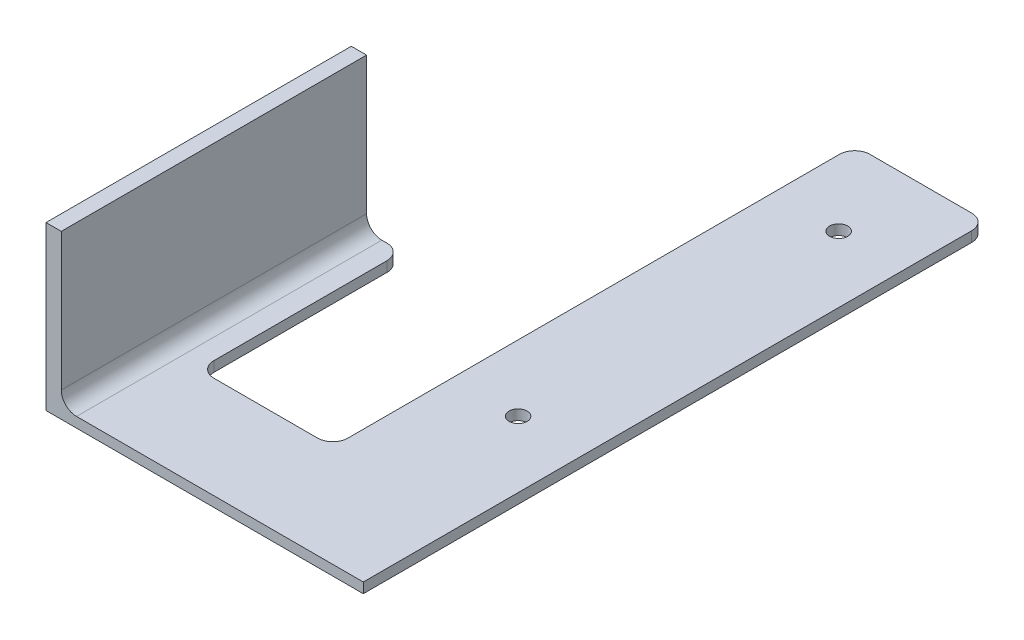
ISO-10303-21;
HEADER;
FILE_DESCRIPTION(('STEP AP214'),'2;1');
FILE_NAME('part.step','',(''),(''),'','','');
FILE_SCHEMA(('AUTOMOTIVE_DESIGN { 1 0 10303 214 1 1 1 1 }'));
ENDSEC;
DATA;
#1=APPLICATION_CONTEXT('core data for automotive mechanical design processes');
#2=APPLICATION_PROTOCOL_DEFINITION('international standard','automotive_design',2000,#1);
#3=PRODUCT_CONTEXT('',#1,'mechanical');
#4=PRODUCT('Part','Part','',(#3));
#5=PRODUCT_RELATED_PRODUCT_CATEGORY('part','',(#4));
#6=PRODUCT_DEFINITION_FORMATION('','',#4);
#7=PRODUCT_DEFINITION_CONTEXT('part definition',#1,'design');
#8=PRODUCT_DEFINITION('design','',#6,#7);
#9=PRODUCT_DEFINITION_SHAPE('','',#8);
#10=(LENGTH_UNIT() NAMED_UNIT(*) SI_UNIT(.MILLI.,.METRE.));
#11=(NAMED_UNIT(*) PLANE_ANGLE_UNIT() SI_UNIT($,.RADIAN.));
#12=(NAMED_UNIT(*) SI_UNIT($,.STERADIAN.) SOLID_ANGLE_UNIT());
#13=UNCERTAINTY_MEASURE_WITH_UNIT(LENGTH_MEASURE(1.E-05),#10,'distance_accuracy_value','');
#14=(GEOMETRIC_REPRESENTATION_CONTEXT(3) GLOBAL_UNCERTAINTY_ASSIGNED_CONTEXT((#13)) GLOBAL_UNIT_ASSIGNED_CONTEXT((#10,
#11,#12)) REPRESENTATION_CONTEXT('',''));
#15=CARTESIAN_POINT('',(0.,0.,0.));
#16=DIRECTION('',(0.,0.,1.));
#17=DIRECTION('',(1.,0.,0.));
#18=AXIS2_PLACEMENT_3D('',#15,#16,#17);
#19=CARTESIAN_POINT('',(-2.47407072094367E-13,2.54,-74.5591968403108));
#20=DIRECTION('',(0.,0.,1.));
#21=DIRECTION('',(1.,0.,0.));
#22=AXIS2_PLACEMENT_3D('',#19,#20,#21);
#23=PLANE('',#22);
#24=DIRECTION('',(-1.,0.,0.));
#25=VECTOR('',#24,1.);
#26=CARTESIAN_POINT('',(-2.47407072094367E-13,2.54,-74.5591968403108));
#27=LINE('',#26,#25);
#28=CARTESIAN_POINT('',(-46.7377884397438,2.54,-74.5591968403106));
#29=VERTEX_POINT('',#28);
#30=CARTESIAN_POINT('',(-72.1377884397438,2.54,-74.5591968403106));
#31=VERTEX_POINT('',#30);
#32=EDGE_CURVE('E254',#29,#31,#27,.T.);
#33=ORIENTED_EDGE('',*,*,#32,.F.);
#34=DIRECTION('',(0.,1.,0.));
#35=VECTOR('',#34,1.);
#36=CARTESIAN_POINT('',(-46.7377884397438,2.54,-74.5591968403106));
#37=LINE('',#36,#35);
#38=CARTESIAN_POINT('',(-46.7377884397438,0.,-74.5591968403106));
#39=VERTEX_POINT('',#38);
#40=EDGE_CURVE('E220',#29,#39,#37,.F.);
#41=ORIENTED_EDGE('',*,*,#40,.T.);
#42=DIRECTION('',(-1.,0.,0.));
#43=VECTOR('',#42,1.);
#44=CARTESIAN_POINT('',(-2.47407072094367E-13,0.,-74.5591968403108));
#45=LINE('',#44,#43);
#46=CARTESIAN_POINT('',(-72.1377884397438,0.,-74.5591968403106));
#47=VERTEX_POINT('',#46);
#48=EDGE_CURVE('E266',#39,#47,#45,.T.);
#49=ORIENTED_EDGE('',*,*,#48,.T.);
#50=DIRECTION('',(0.,1.,0.));
#51=VECTOR('',#50,1.);
#52=CARTESIAN_POINT('',(-72.1377884397438,2.54,-74.5591968403106));
#53=LINE('',#52,#51);
#54=EDGE_CURVE('E217',#47,#31,#53,.T.);
#55=ORIENTED_EDGE('',*,*,#54,.T.);
#56=EDGE_LOOP('',(#33,#41,#49,#55));
#57=FACE_BOUND('',#56,.T.);
#58=ADVANCED_FACE('F41',(#57),#23,.F.);
#59=CARTESIAN_POINT('',(0.,2.54,0.));
#60=DIRECTION('',(0.,1.,0.));
#61=DIRECTION('',(0.,0.,1.));
#62=AXIS2_PLACEMENT_3D('',#59,#60,#61);
#63=PLANE('',#62);
#64=DIRECTION('',(0.,0.,1.));
#65=VECTOR('',#64,1.);
#66=CARTESIAN_POINT('',(-42.9277884397437,2.54,0.));
#67=LINE('',#66,#65);
#68=CARTESIAN_POINT('',(-42.9277884397437,2.54,-70.7491968403107));
#69=VERTEX_POINT('',#68);
#70=CARTESIAN_POINT('',(-42.9277884397437,2.54,81.0998031596896));
#71=VERTEX_POINT('',#70);
#72=EDGE_CURVE('E251',#69,#71,#67,.T.);
#73=ORIENTED_EDGE('',*,*,#72,.F.);
#74=CARTESIAN_POINT('',(-46.7377884397437,2.54,-70.7491968403107));
#75=DIRECTION('',(0.,1.,0.));
#76=DIRECTION('',(0.,0.,1.));
#77=AXIS2_PLACEMENT_3D('',#74,#75,#76);
#78=CIRCLE('',#77,3.81);
#79=EDGE_CURVE('E215',#69,#29,#78,.T.);
#80=ORIENTED_EDGE('',*,*,#79,.T.);
#81=ORIENTED_EDGE('',*,*,#32,.T.);
#82=CARTESIAN_POINT('',(-72.1377884397437,2.54,-70.7491968403106));
#83=DIRECTION('',(0.,1.,0.));
#84=DIRECTION('',(0.,0.,1.));
#85=AXIS2_PLACEMENT_3D('',#82,#83,#84);
#86=CIRCLE('',#85,3.81);
#87=CARTESIAN_POINT('',(-75.9477884397437,2.54,-70.7491968403106));
#88=VERTEX_POINT('',#87);
#89=EDGE_CURVE('E213',#31,#88,#86,.T.);
#90=ORIENTED_EDGE('',*,*,#89,.T.);
#91=DIRECTION('',(0.,0.,1.));
#92=VECTOR('',#91,1.);
#93=CARTESIAN_POINT('',(-75.9477884397437,2.54,0.));
#94=LINE('',#93,#92);
#95=CARTESIAN_POINT('',(-75.9477884397437,2.54,51.8898031596896));
#96=VERTEX_POINT('',#95);
#97=EDGE_CURVE('E240',#88,#96,#94,.T.);
#98=ORIENTED_EDGE('',*,*,#97,.T.);
#99=CARTESIAN_POINT('',(-79.7577884397437,2.54,51.8898031596896));
#100=DIRECTION('',(0.,1.,0.));
#101=DIRECTION('',(0.,0.,1.));
#102=AXIS2_PLACEMENT_3D('',#99,#100,#101);
#103=CIRCLE('',#102,3.81);
#104=CARTESIAN_POINT('',(-79.7577884397437,2.54,55.6998031596896));
#105=VERTEX_POINT('',#104);
#106=EDGE_CURVE('E200',#96,#105,#103,.F.);
#107=ORIENTED_EDGE('',*,*,#106,.T.);
#108=DIRECTION('',(-1.,0.,0.));
#109=VECTOR('',#108,1.);
#110=CARTESIAN_POINT('',(0.,2.54,55.6998031596896));
#111=LINE('',#110,#109);
#112=CARTESIAN_POINT('',(-105.610032318675,2.54,55.6998031596896));
#113=VERTEX_POINT('',#112);
#114=EDGE_CURVE('E237',#105,#113,#111,.T.);
#115=ORIENTED_EDGE('',*,*,#114,.T.);
#116=CARTESIAN_POINT('',(-105.610032318675,2.54,51.8898031596896));
#117=DIRECTION('',(0.,1.,0.));
#118=DIRECTION('',(0.,0.,1.));
#119=AXIS2_PLACEMENT_3D('',#116,#117,#118);
#120=CIRCLE('',#119,3.81);
#121=CARTESIAN_POINT('',(-109.420032318675,2.54,51.8898031596896));
#122=VERTEX_POINT('',#121);
#123=EDGE_CURVE('E205',#113,#122,#120,.F.);
#124=ORIENTED_EDGE('',*,*,#123,.T.);
#125=DIRECTION('',(0.,0.,-1.));
#126=VECTOR('',#125,1.);
#127=CARTESIAN_POINT('',(-109.420032318675,2.54,0.));
#128=LINE('',#127,#126);
#129=CARTESIAN_POINT('',(-109.420032318675,2.54,8.70980315968959));
#130=VERTEX_POINT('',#129);
#131=EDGE_CURVE('E232',#122,#130,#128,.T.);
#132=ORIENTED_EDGE('',*,*,#131,.T.);
#133=CARTESIAN_POINT('',(-113.230032318675,2.54,8.70980315968959));
#134=DIRECTION('',(0.,1.,0.));
#135=DIRECTION('',(0.,0.,1.));
#136=AXIS2_PLACEMENT_3D('',#133,#134,#135);
#137=CIRCLE('',#136,3.81);
#138=CARTESIAN_POINT('',(-113.230032318675,2.54,4.89980315968959));
#139=VERTEX_POINT('',#138);
#140=EDGE_CURVE('E165',#130,#139,#137,.T.);
#141=ORIENTED_EDGE('',*,*,#140,.T.);
#142=DIRECTION('',(1.,0.,0.));
#143=VECTOR('',#142,1.);
#144=CARTESIAN_POINT('',(0.,2.54,4.89980315968959));
#145=LINE('',#144,#143);
#146=CARTESIAN_POINT('',(-114.500032318675,2.54,4.89980315968959));
#147=VERTEX_POINT('',#146);
#148=EDGE_CURVE('E155',#147,#139,#145,.T.);
#149=ORIENTED_EDGE('',*,*,#148,.F.);
#150=DIRECTION('',(0.,0.,-1.));
#151=VECTOR('',#150,1.);
#152=CARTESIAN_POINT('',(-114.500032318675,2.54,0.));
#153=LINE('',#152,#151);
#154=CARTESIAN_POINT('',(-114.500032318675,2.54,81.0998031596896));
#155=VERTEX_POINT('',#154);
#156=EDGE_CURVE('E162',#147,#155,#153,.F.);
#157=ORIENTED_EDGE('',*,*,#156,.T.);
#158=DIRECTION('',(1.,0.,0.));
#159=VECTOR('',#158,1.);
#160=CARTESIAN_POINT('',(0.,2.54,81.0998031596896));
#161=LINE('',#160,#159);
#162=EDGE_CURVE('E257',#155,#71,#161,.T.);
#163=ORIENTED_EDGE('',*,*,#162,.T.);
#164=EDGE_LOOP('',(#73,#80,#81,#90,#98,#107,#115,#124,#132,#141,#149,#157,#163));
#165=FACE_BOUND('',#164,.T.);
#166=CARTESIAN_POINT('',(-59.4377884397437,2.54,25.9508031596896));
#167=DIRECTION('',(0.,1.,0.));
#168=DIRECTION('',(0.,0.,1.));
#169=AXIS2_PLACEMENT_3D('',#166,#167,#168);
#170=CIRCLE('',#169,2.24999999999995);
#171=CARTESIAN_POINT('',(-59.4377884397437,2.54,28.2008031596895));
#172=VERTEX_POINT('',#171);
#173=EDGE_CURVE('E260',#172,#172,#170,.T.);
#174=ORIENTED_EDGE('',*,*,#173,.F.);
#175=EDGE_LOOP('',(#174));
#176=FACE_BOUND('',#175,.T.);
#177=CARTESIAN_POINT('',(-59.4377884397437,2.54,-54.0491968403104));
#178=DIRECTION('',(0.,1.,0.));
#179=DIRECTION('',(0.,0.,1.));
#180=AXIS2_PLACEMENT_3D('',#177,#178,#179);
#181=CIRCLE('',#180,2.24999999999995);
#182=CARTESIAN_POINT('',(-59.4377884397437,2.54,-51.7991968403105));
#183=VERTEX_POINT('',#182);
#184=EDGE_CURVE('E263',#183,#183,#181,.T.);
#185=ORIENTED_EDGE('',*,*,#184,.F.);
#186=EDGE_LOOP('',(#185));
#187=FACE_BOUND('',#186,.T.);
#188=ADVANCED_FACE('F158',(#165,#176,#187),#63,.T.);
#189=CARTESIAN_POINT('',(0.,0.,0.));
#190=DIRECTION('',(0.,1.,0.));
#191=DIRECTION('',(0.,0.,1.));
#192=AXIS2_PLACEMENT_3D('',#189,#190,#191);
#193=PLANE('',#192);
#194=CARTESIAN_POINT('',(-59.4377884397437,0.,-54.0491968403104));
#195=DIRECTION('',(0.,1.,0.));
#196=DIRECTION('',(0.,0.,1.));
#197=AXIS2_PLACEMENT_3D('',#194,#195,#196);
#198=CIRCLE('',#197,2.24999999999995);
#199=CARTESIAN_POINT('',(-59.4377884397437,0.,-51.7991968403105));
#200=VERTEX_POINT('',#199);
#201=EDGE_CURVE('E258',#200,#200,#198,.T.);
#202=ORIENTED_EDGE('',*,*,#201,.T.);
#203=EDGE_LOOP('',(#202));
#204=FACE_BOUND('',#203,.T.);
#205=CARTESIAN_POINT('',(-59.4377884397437,0.,25.9508031596896));
#206=DIRECTION('',(0.,1.,0.));
#207=DIRECTION('',(0.,0.,1.));
#208=AXIS2_PLACEMENT_3D('',#205,#206,#207);
#209=CIRCLE('',#208,2.24999999999995);
#210=CARTESIAN_POINT('',(-59.4377884397437,0.,28.2008031596895));
#211=VERTEX_POINT('',#210);
#212=EDGE_CURVE('E275',#211,#211,#209,.T.);
#213=ORIENTED_EDGE('',*,*,#212,.T.);
#214=EDGE_LOOP('',(#213));
#215=FACE_BOUND('',#214,.T.);
#216=ORIENTED_EDGE('',*,*,#48,.F.);
#217=CARTESIAN_POINT('',(-46.7377884397437,0.,-70.7491968403107));
#218=DIRECTION('',(0.,1.,0.));
#219=DIRECTION('',(0.,0.,1.));
#220=AXIS2_PLACEMENT_3D('',#217,#218,#219);
#221=CIRCLE('',#220,3.81);
#222=CARTESIAN_POINT('',(-42.9277884397437,0.,-70.7491968403107));
#223=VERTEX_POINT('',#222);
#224=EDGE_CURVE('E225',#39,#223,#221,.F.);
#225=ORIENTED_EDGE('',*,*,#224,.T.);
#226=DIRECTION('',(0.,0.,1.));
#227=VECTOR('',#226,1.);
#228=CARTESIAN_POINT('',(-42.9277884397437,0.,0.));
#229=LINE('',#228,#227);
#230=CARTESIAN_POINT('',(-42.9277884397437,0.,81.0998031596896));
#231=VERTEX_POINT('',#230);
#232=EDGE_CURVE('E243',#223,#231,#229,.T.);
#233=ORIENTED_EDGE('',*,*,#232,.T.);
#234=DIRECTION('',(1.,0.,0.));
#235=VECTOR('',#234,1.);
#236=CARTESIAN_POINT('',(0.,0.,81.0998031596896));
#237=LINE('',#236,#235);
#238=CARTESIAN_POINT('',(-122.120032318675,0.,81.0998031596896));
#239=VERTEX_POINT('',#238);
#240=EDGE_CURVE('E272',#239,#231,#237,.T.);
#241=ORIENTED_EDGE('',*,*,#240,.F.);
#242=DIRECTION('',(0.,0.,-1.));
#243=VECTOR('',#242,1.);
#244=CARTESIAN_POINT('',(-122.120032318675,0.,0.));
#245=LINE('',#244,#243);
#246=CARTESIAN_POINT('',(-122.120032318675,0.,4.89980315968959));
#247=VERTEX_POINT('',#246);
#248=EDGE_CURVE('E269',#239,#247,#245,.T.);
#249=ORIENTED_EDGE('',*,*,#248,.T.);
#250=DIRECTION('',(1.,0.,0.));
#251=VECTOR('',#250,1.);
#252=CARTESIAN_POINT('',(0.,0.,4.89980315968959));
#253=LINE('',#252,#251);
#254=CARTESIAN_POINT('',(-113.230032318675,0.,4.89980315968959));
#255=VERTEX_POINT('',#254);
#256=EDGE_CURVE('E168',#247,#255,#253,.T.);
#257=ORIENTED_EDGE('',*,*,#256,.T.);
#258=CARTESIAN_POINT('',(-113.230032318675,0.,8.70980315968959));
#259=DIRECTION('',(0.,1.,0.));
#260=DIRECTION('',(0.,0.,1.));
#261=AXIS2_PLACEMENT_3D('',#258,#259,#260);
#262=CIRCLE('',#261,3.81);
#263=CARTESIAN_POINT('',(-109.420032318675,0.,8.70980315968959));
#264=VERTEX_POINT('',#263);
#265=EDGE_CURVE('E64',#255,#264,#262,.F.);
#266=ORIENTED_EDGE('',*,*,#265,.T.);
#267=DIRECTION('',(0.,0.,-1.));
#268=VECTOR('',#267,1.);
#269=CARTESIAN_POINT('',(-109.420032318675,0.,0.));
#270=LINE('',#269,#268);
#271=CARTESIAN_POINT('',(-109.420032318675,0.,51.8898031596896));
#272=VERTEX_POINT('',#271);
#273=EDGE_CURVE('E234',#272,#264,#270,.T.);
#274=ORIENTED_EDGE('',*,*,#273,.F.);
#275=CARTESIAN_POINT('',(-105.610032318675,0.,51.8898031596896));
#276=DIRECTION('',(0.,1.,0.));
#277=DIRECTION('',(0.,0.,1.));
#278=AXIS2_PLACEMENT_3D('',#275,#276,#277);
#279=CIRCLE('',#278,3.81);
#280=CARTESIAN_POINT('',(-105.610032318675,0.,55.6998031596896));
#281=VERTEX_POINT('',#280);
#282=EDGE_CURVE('E207',#272,#281,#279,.T.);
#283=ORIENTED_EDGE('',*,*,#282,.T.);
#284=DIRECTION('',(-1.,0.,0.));
#285=VECTOR('',#284,1.);
#286=CARTESIAN_POINT('',(0.,0.,55.6998031596896));
#287=LINE('',#286,#285);
#288=CARTESIAN_POINT('',(-79.7577884397437,0.,55.6998031596896));
#289=VERTEX_POINT('',#288);
#290=EDGE_CURVE('E310',#289,#281,#287,.T.);
#291=ORIENTED_EDGE('',*,*,#290,.F.);
#292=CARTESIAN_POINT('',(-79.7577884397437,0.,51.8898031596896));
#293=DIRECTION('',(0.,1.,0.));
#294=DIRECTION('',(0.,0.,1.));
#295=AXIS2_PLACEMENT_3D('',#292,#293,#294);
#296=CIRCLE('',#295,3.81);
#297=CARTESIAN_POINT('',(-75.9477884397437,0.,51.8898031596896));
#298=VERTEX_POINT('',#297);
#299=EDGE_CURVE('E202',#289,#298,#296,.T.);
#300=ORIENTED_EDGE('',*,*,#299,.T.);
#301=DIRECTION('',(0.,0.,1.));
#302=VECTOR('',#301,1.);
#303=CARTESIAN_POINT('',(-75.9477884397437,0.,0.));
#304=LINE('',#303,#302);
#305=CARTESIAN_POINT('',(-75.9477884397437,0.,-70.7491968403106));
#306=VERTEX_POINT('',#305);
#307=EDGE_CURVE('E246',#306,#298,#304,.T.);
#308=ORIENTED_EDGE('',*,*,#307,.F.);
#309=CARTESIAN_POINT('',(-72.1377884397437,0.,-70.7491968403106));
#310=DIRECTION('',(0.,1.,0.));
#311=DIRECTION('',(0.,0.,1.));
#312=AXIS2_PLACEMENT_3D('',#309,#310,#311);
#313=CIRCLE('',#312,3.81);
#314=EDGE_CURVE('E223',#306,#47,#313,.F.);
#315=ORIENTED_EDGE('',*,*,#314,.T.);
#316=EDGE_LOOP('',(#216,#225,#233,#241,#249,#257,#266,#274,#283,#291,#300,#308,#315));
#317=FACE_BOUND('',#316,.T.);
#318=ADVANCED_FACE('F290',(#204,#215,#317),#193,.F.);
#319=CARTESIAN_POINT('',(-122.120032318675,2.54,0.));
#320=DIRECTION('',(-1.,0.,0.));
#321=DIRECTION('',(0.,0.,1.));
#322=AXIS2_PLACEMENT_3D('',#319,#320,#321);
#323=PLANE('',#322);
#324=DIRECTION('',(0.,-1.,0.));
#325=VECTOR('',#324,1.);
#326=CARTESIAN_POINT('',(-122.120032318675,40.64,4.89980315968959));
#327=LINE('',#326,#325);
#328=CARTESIAN_POINT('',(-122.120032318675,40.64,4.89980315968959));
#329=VERTEX_POINT('',#328);
#330=EDGE_CURVE('E295',#329,#247,#327,.T.);
#331=ORIENTED_EDGE('',*,*,#330,.T.);
#332=ORIENTED_EDGE('',*,*,#248,.F.);
#333=DIRECTION('',(0.,-1.,0.));
#334=VECTOR('',#333,1.);
#335=CARTESIAN_POINT('',(-122.120032318675,2.54,81.0998031596896));
#336=LINE('',#335,#334);
#337=CARTESIAN_POINT('',(-122.120032318675,40.64,81.0998031596896));
#338=VERTEX_POINT('',#337);
#339=EDGE_CURVE('E185',#338,#239,#336,.T.);
#340=ORIENTED_EDGE('',*,*,#339,.F.);
#341=DIRECTION('',(0.,0.,1.));
#342=VECTOR('',#341,1.);
#343=CARTESIAN_POINT('',(-122.120032318675,40.64,81.0998031596896));
#344=LINE('',#343,#342);
#345=EDGE_CURVE('E297',#329,#338,#344,.T.);
#346=ORIENTED_EDGE('',*,*,#345,.F.);
#347=EDGE_LOOP('',(#331,#332,#340,#346));
#348=FACE_BOUND('',#347,.T.);
#349=ADVANCED_FACE('F293',(#348),#323,.T.);
#350=CARTESIAN_POINT('',(-59.4377884397437,2.54,25.9508031596896));
#351=DIRECTION('',(0.,-1.,0.));
#352=DIRECTION('',(0.,0.,-1.));
#353=AXIS2_PLACEMENT_3D('',#350,#351,#352);
#354=CYLINDRICAL_SURFACE('',#353,2.24999999999995);
#355=ORIENTED_EDGE('',*,*,#173,.T.);
#356=EDGE_LOOP('',(#355));
#357=FACE_BOUND('',#356,.T.);
#358=ORIENTED_EDGE('',*,*,#212,.F.);
#359=EDGE_LOOP('',(#358));
#360=FACE_BOUND('',#359,.T.);
#361=ADVANCED_FACE('F383',(#357,#360),#354,.F.);
#362=CARTESIAN_POINT('',(0.,2.54,81.0998031596896));
#363=DIRECTION('',(0.,0.,-1.));
#364=DIRECTION('',(-1.,0.,0.));
#365=AXIS2_PLACEMENT_3D('',#362,#363,#364);
#366=PLANE('',#365);
#367=ORIENTED_EDGE('',*,*,#240,.T.);
#368=DIRECTION('',(0.,1.,0.));
#369=VECTOR('',#368,1.);
#370=CARTESIAN_POINT('',(-42.9277884397437,0.,81.0998031596896));
#371=LINE('',#370,#369);
#372=EDGE_CURVE('E238',#231,#71,#371,.T.);
#373=ORIENTED_EDGE('',*,*,#372,.T.);
#374=ORIENTED_EDGE('',*,*,#162,.F.);
#375=CARTESIAN_POINT('',(-114.500032318675,6.35,81.0998031596896));
#376=DIRECTION('',(0.,0.,-1.));
#377=DIRECTION('',(-1.,0.,0.));
#378=AXIS2_PLACEMENT_3D('',#375,#376,#377);
#379=CIRCLE('',#378,3.81);
#380=CARTESIAN_POINT('',(-118.310032318675,6.35000000000002,81.0998031596896));
#381=VERTEX_POINT('',#380);
#382=EDGE_CURVE('E179',#155,#381,#379,.T.);
#383=ORIENTED_EDGE('',*,*,#382,.T.);
#384=DIRECTION('',(0.,-1.,0.));
#385=VECTOR('',#384,1.);
#386=CARTESIAN_POINT('',(-118.310032318675,40.64,81.0998031596896));
#387=LINE('',#386,#385);
#388=CARTESIAN_POINT('',(-118.310032318675,40.64,81.0998031596896));
#389=VERTEX_POINT('',#388);
#390=EDGE_CURVE('E252',#389,#381,#387,.T.);
#391=ORIENTED_EDGE('',*,*,#390,.F.);
#392=DIRECTION('',(1.,0.,0.));
#393=VECTOR('',#392,1.);
#394=CARTESIAN_POINT('',(-122.120032318675,40.64,81.0998031596896));
#395=LINE('',#394,#393);
#396=EDGE_CURVE('E284',#338,#389,#395,.T.);
#397=ORIENTED_EDGE('',*,*,#396,.F.);
#398=ORIENTED_EDGE('',*,*,#339,.T.);
#399=EDGE_LOOP('',(#367,#373,#374,#383,#391,#397,#398));
#400=FACE_BOUND('',#399,.T.);
#401=ADVANCED_FACE('F282',(#400),#366,.F.);
#402=CARTESIAN_POINT('',(-59.4377884397437,2.54,-54.0491968403104));
#403=DIRECTION('',(0.,-1.,0.));
#404=DIRECTION('',(0.,0.,-1.));
#405=AXIS2_PLACEMENT_3D('',#402,#403,#404);
#406=CYLINDRICAL_SURFACE('',#405,2.24999999999995);
#407=ORIENTED_EDGE('',*,*,#184,.T.);
#408=EDGE_LOOP('',(#407));
#409=FACE_BOUND('',#408,.T.);
#410=ORIENTED_EDGE('',*,*,#201,.F.);
#411=EDGE_LOOP('',(#410));
#412=FACE_BOUND('',#411,.T.);
#413=ADVANCED_FACE('F374',(#409,#412),#406,.F.);
#414=CARTESIAN_POINT('',(-42.9277884397437,0.,0.));
#415=DIRECTION('',(-1.,0.,0.));
#416=DIRECTION('',(0.,0.,1.));
#417=AXIS2_PLACEMENT_3D('',#414,#415,#416);
#418=PLANE('',#417);
#419=ORIENTED_EDGE('',*,*,#232,.F.);
#420=DIRECTION('',(0.,1.,0.));
#421=VECTOR('',#420,1.);
#422=CARTESIAN_POINT('',(-42.9277884397437,0.,-70.7491968403107));
#423=LINE('',#422,#421);
#424=EDGE_CURVE('E209',#223,#69,#423,.T.);
#425=ORIENTED_EDGE('',*,*,#424,.T.);
#426=ORIENTED_EDGE('',*,*,#72,.T.);
#427=ORIENTED_EDGE('',*,*,#372,.F.);
#428=EDGE_LOOP('',(#419,#425,#426,#427));
#429=FACE_BOUND('',#428,.T.);
#430=ADVANCED_FACE('F372',(#429),#418,.F.);
#431=CARTESIAN_POINT('',(-109.420032318675,0.,0.));
#432=DIRECTION('',(1.,0.,0.));
#433=DIRECTION('',(0.,0.,-1.));
#434=AXIS2_PLACEMENT_3D('',#431,#432,#433);
#435=PLANE('',#434);
#436=ORIENTED_EDGE('',*,*,#273,.T.);
#437=DIRECTION('',(0.,1.,0.));
#438=VECTOR('',#437,1.);
#439=CARTESIAN_POINT('',(-109.420032318675,2.54,8.70980315968959));
#440=LINE('',#439,#438);
#441=EDGE_CURVE('E49',#264,#130,#440,.T.);
#442=ORIENTED_EDGE('',*,*,#441,.T.);
#443=ORIENTED_EDGE('',*,*,#131,.F.);
#444=DIRECTION('',(0.,1.,0.));
#445=VECTOR('',#444,1.);
#446=CARTESIAN_POINT('',(-109.420032318675,0.,51.8898031596896));
#447=LINE('',#446,#445);
#448=EDGE_CURVE('E198',#122,#272,#447,.F.);
#449=ORIENTED_EDGE('',*,*,#448,.T.);
#450=EDGE_LOOP('',(#436,#442,#443,#449));
#451=FACE_BOUND('',#450,.T.);
#452=ADVANCED_FACE('F231',(#451),#435,.T.);
#453=CARTESIAN_POINT('',(-75.9477884397437,0.,0.));
#454=DIRECTION('',(-1.,0.,0.));
#455=DIRECTION('',(0.,0.,1.));
#456=AXIS2_PLACEMENT_3D('',#453,#454,#455);
#457=PLANE('',#456);
#458=ORIENTED_EDGE('',*,*,#97,.F.);
#459=DIRECTION('',(0.,1.,0.));
#460=VECTOR('',#459,1.);
#461=CARTESIAN_POINT('',(-75.9477884397437,0.,-70.7491968403106));
#462=LINE('',#461,#460);
#463=EDGE_CURVE('E56',#88,#306,#462,.F.);
#464=ORIENTED_EDGE('',*,*,#463,.T.);
#465=ORIENTED_EDGE('',*,*,#307,.T.);
#466=DIRECTION('',(0.,1.,0.));
#467=VECTOR('',#466,1.);
#468=CARTESIAN_POINT('',(-75.9477884397437,2.54,51.8898031596896));
#469=LINE('',#468,#467);
#470=EDGE_CURVE('E190',#298,#96,#469,.T.);
#471=ORIENTED_EDGE('',*,*,#470,.T.);
#472=EDGE_LOOP('',(#458,#464,#465,#471));
#473=FACE_BOUND('',#472,.T.);
#474=ADVANCED_FACE('F315',(#473),#457,.T.);
#475=CARTESIAN_POINT('',(0.,0.,55.6998031596896));
#476=DIRECTION('',(0.,0.,-1.));
#477=DIRECTION('',(-1.,0.,0.));
#478=AXIS2_PLACEMENT_3D('',#475,#476,#477);
#479=PLANE('',#478);
#480=ORIENTED_EDGE('',*,*,#114,.F.);
#481=DIRECTION('',(0.,1.,0.));
#482=VECTOR('',#481,1.);
#483=CARTESIAN_POINT('',(-79.7577884397437,0.,55.6998031596896));
#484=LINE('',#483,#482);
#485=EDGE_CURVE('E196',#105,#289,#484,.F.);
#486=ORIENTED_EDGE('',*,*,#485,.T.);
#487=ORIENTED_EDGE('',*,*,#290,.T.);
#488=DIRECTION('',(0.,1.,0.));
#489=VECTOR('',#488,1.);
#490=CARTESIAN_POINT('',(-105.610032318675,2.54,55.6998031596896));
#491=LINE('',#490,#489);
#492=EDGE_CURVE('E193',#281,#113,#491,.T.);
#493=ORIENTED_EDGE('',*,*,#492,.T.);
#494=EDGE_LOOP('',(#480,#486,#487,#493));
#495=FACE_BOUND('',#494,.T.);
#496=ADVANCED_FACE('F324',(#495),#479,.T.);
#497=CARTESIAN_POINT('',(-118.310032318675,40.64,81.0998031596896));
#498=DIRECTION('',(-1.,0.,0.));
#499=DIRECTION('',(0.,0.,1.));
#500=AXIS2_PLACEMENT_3D('',#497,#498,#499);
#501=PLANE('',#500);
#502=ORIENTED_EDGE('',*,*,#390,.T.);
#503=DIRECTION('',(0.,0.,-1.));
#504=VECTOR('',#503,1.);
#505=CARTESIAN_POINT('',(-118.310032318675,6.35,81.0998031596896));
#506=LINE('',#505,#504);
#507=CARTESIAN_POINT('',(-118.310032318675,6.35000000000002,4.89980315968959));
#508=VERTEX_POINT('',#507);
#509=EDGE_CURVE('E183',#381,#508,#506,.T.);
#510=ORIENTED_EDGE('',*,*,#509,.T.);
#511=DIRECTION('',(0.,-1.,0.));
#512=VECTOR('',#511,1.);
#513=CARTESIAN_POINT('',(-118.310032318675,40.64,4.89980315968959));
#514=LINE('',#513,#512);
#515=CARTESIAN_POINT('',(-118.310032318675,40.64,4.89980315968959));
#516=VERTEX_POINT('',#515);
#517=EDGE_CURVE('E175',#516,#508,#514,.T.);
#518=ORIENTED_EDGE('',*,*,#517,.F.);
#519=DIRECTION('',(0.,0.,-1.));
#520=VECTOR('',#519,1.);
#521=CARTESIAN_POINT('',(-118.310032318675,40.64,81.0998031596896));
#522=LINE('',#521,#520);
#523=EDGE_CURVE('E304',#389,#516,#522,.T.);
#524=ORIENTED_EDGE('',*,*,#523,.F.);
#525=EDGE_LOOP('',(#502,#510,#518,#524));
#526=FACE_BOUND('',#525,.T.);
#527=ADVANCED_FACE('F360',(#526),#501,.F.);
#528=CARTESIAN_POINT('',(-122.120032318675,40.64,4.89980315968959));
#529=DIRECTION('',(0.,0.,1.));
#530=DIRECTION('',(1.,0.,0.));
#531=AXIS2_PLACEMENT_3D('',#528,#529,#530);
#532=PLANE('',#531);
#533=ORIENTED_EDGE('',*,*,#148,.T.);
#534=DIRECTION('',(0.,1.,0.));
#535=VECTOR('',#534,1.);
#536=CARTESIAN_POINT('',(-113.230032318675,0.,4.89980315968959));
#537=LINE('',#536,#535);
#538=EDGE_CURVE('E11',#139,#255,#537,.F.);
#539=ORIENTED_EDGE('',*,*,#538,.T.);
#540=ORIENTED_EDGE('',*,*,#256,.F.);
#541=ORIENTED_EDGE('',*,*,#330,.F.);
#542=DIRECTION('',(-1.,0.,0.));
#543=VECTOR('',#542,1.);
#544=CARTESIAN_POINT('',(-122.120032318675,40.64,4.89980315968959));
#545=LINE('',#544,#543);
#546=EDGE_CURVE('E298',#516,#329,#545,.T.);
#547=ORIENTED_EDGE('',*,*,#546,.F.);
#548=ORIENTED_EDGE('',*,*,#517,.T.);
#549=CARTESIAN_POINT('',(-114.500032318675,6.35,4.89980315968959));
#550=DIRECTION('',(0.,0.,1.));
#551=DIRECTION('',(1.,0.,0.));
#552=AXIS2_PLACEMENT_3D('',#549,#550,#551);
#553=CIRCLE('',#552,3.81);
#554=EDGE_CURVE('E171',#508,#147,#553,.T.);
#555=ORIENTED_EDGE('',*,*,#554,.T.);
#556=EDGE_LOOP('',(#533,#539,#540,#541,#547,#548,#555));
#557=FACE_BOUND('',#556,.T.);
#558=ADVANCED_FACE('F172',(#557),#532,.F.);
#559=CARTESIAN_POINT('',(0.,40.64,0.));
#560=DIRECTION('',(0.,-1.,0.));
#561=DIRECTION('',(0.,0.,-1.));
#562=AXIS2_PLACEMENT_3D('',#559,#560,#561);
#563=PLANE('',#562);
#564=ORIENTED_EDGE('',*,*,#345,.T.);
#565=ORIENTED_EDGE('',*,*,#396,.T.);
#566=ORIENTED_EDGE('',*,*,#523,.T.);
#567=ORIENTED_EDGE('',*,*,#546,.T.);
#568=EDGE_LOOP('',(#564,#565,#566,#567));
#569=FACE_BOUND('',#568,.T.);
#570=ADVANCED_FACE('F351',(#569),#563,.F.);
#571=CARTESIAN_POINT('',(-114.500032318675,6.35,81.0998031596896));
#572=DIRECTION('',(0.,0.,-1.));
#573=DIRECTION('',(-1.,0.,0.));
#574=AXIS2_PLACEMENT_3D('',#571,#572,#573);
#575=CYLINDRICAL_SURFACE('',#574,3.81);
#576=ORIENTED_EDGE('',*,*,#382,.F.);
#577=ORIENTED_EDGE('',*,*,#156,.F.);
#578=ORIENTED_EDGE('',*,*,#554,.F.);
#579=ORIENTED_EDGE('',*,*,#509,.F.);
#580=EDGE_LOOP('',(#576,#577,#578,#579));
#581=FACE_BOUND('',#580,.T.);
#582=ADVANCED_FACE('F182',(#581),#575,.F.);
#583=CARTESIAN_POINT('',(-79.7577884397437,0.,51.8898031596896));
#584=DIRECTION('',(0.,-1.,0.));
#585=DIRECTION('',(0.,0.,-1.));
#586=AXIS2_PLACEMENT_3D('',#583,#584,#585);
#587=CYLINDRICAL_SURFACE('',#586,3.81);
#588=ORIENTED_EDGE('',*,*,#299,.F.);
#589=ORIENTED_EDGE('',*,*,#485,.F.);
#590=ORIENTED_EDGE('',*,*,#106,.F.);
#591=ORIENTED_EDGE('',*,*,#470,.F.);
#592=EDGE_LOOP('',(#588,#589,#590,#591));
#593=FACE_BOUND('',#592,.T.);
#594=ADVANCED_FACE('F322',(#593),#587,.F.);
#595=CARTESIAN_POINT('',(-105.610032318675,0.,51.8898031596896));
#596=DIRECTION('',(0.,-1.,0.));
#597=DIRECTION('',(0.,0.,-1.));
#598=AXIS2_PLACEMENT_3D('',#595,#596,#597);
#599=CYLINDRICAL_SURFACE('',#598,3.81);
#600=ORIENTED_EDGE('',*,*,#282,.F.);
#601=ORIENTED_EDGE('',*,*,#448,.F.);
#602=ORIENTED_EDGE('',*,*,#123,.F.);
#603=ORIENTED_EDGE('',*,*,#492,.F.);
#604=EDGE_LOOP('',(#600,#601,#602,#603));
#605=FACE_BOUND('',#604,.T.);
#606=ADVANCED_FACE('F327',(#605),#599,.F.);
#607=CARTESIAN_POINT('',(-46.7377884397437,0.,-70.7491968403107));
#608=DIRECTION('',(0.,1.,0.));
#609=DIRECTION('',(0.,0.,1.));
#610=AXIS2_PLACEMENT_3D('',#607,#608,#609);
#611=CYLINDRICAL_SURFACE('',#610,3.81);
#612=ORIENTED_EDGE('',*,*,#224,.F.);
#613=ORIENTED_EDGE('',*,*,#40,.F.);
#614=ORIENTED_EDGE('',*,*,#79,.F.);
#615=ORIENTED_EDGE('',*,*,#424,.F.);
#616=EDGE_LOOP('',(#612,#613,#614,#615));
#617=FACE_BOUND('',#616,.T.);
#618=ADVANCED_FACE('F329',(#617),#611,.T.);
#619=CARTESIAN_POINT('',(-72.1377884397437,2.54,-70.7491968403106));
#620=DIRECTION('',(0.,-1.,0.));
#621=DIRECTION('',(0.,0.,-1.));
#622=AXIS2_PLACEMENT_3D('',#619,#620,#621);
#623=CYLINDRICAL_SURFACE('',#622,3.81);
#624=ORIENTED_EDGE('',*,*,#314,.F.);
#625=ORIENTED_EDGE('',*,*,#463,.F.);
#626=ORIENTED_EDGE('',*,*,#89,.F.);
#627=ORIENTED_EDGE('',*,*,#54,.F.);
#628=EDGE_LOOP('',(#624,#625,#626,#627));
#629=FACE_BOUND('',#628,.T.);
#630=ADVANCED_FACE('F335',(#629),#623,.T.);
#631=CARTESIAN_POINT('',(-113.230032318675,0.,8.70980315968959));
#632=DIRECTION('',(0.,-1.,0.));
#633=DIRECTION('',(0.,0.,-1.));
#634=AXIS2_PLACEMENT_3D('',#631,#632,#633);
#635=CYLINDRICAL_SURFACE('',#634,3.81);
#636=ORIENTED_EDGE('',*,*,#265,.F.);
#637=ORIENTED_EDGE('',*,*,#538,.F.);
#638=ORIENTED_EDGE('',*,*,#140,.F.);
#639=ORIENTED_EDGE('',*,*,#441,.F.);
#640=EDGE_LOOP('',(#636,#637,#638,#639));
#641=FACE_BOUND('',#640,.T.);
#642=ADVANCED_FACE('F43',(#641),#635,.T.);
#643=CLOSED_SHELL('',(#58,#188,#318,#349,#361,#401,#413,#430,#452,#474,#496,#527,#558,#570,#582,
#594,#606,#618,#630,#642));
#644=MANIFOLD_SOLID_BREP('B2',#643);
#645=ADVANCED_BREP_SHAPE_REPRESENTATION('',(#18,#644),#14);
#646=SHAPE_DEFINITION_REPRESENTATION(#9,#645);
ENDSEC;
END-ISO-10303-21;
